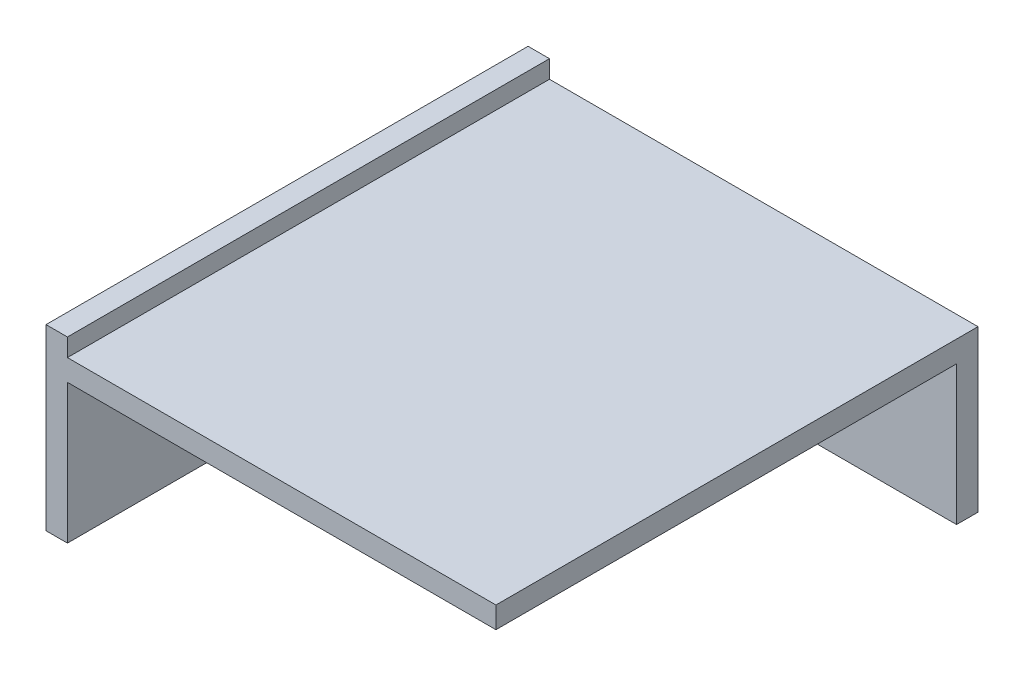
ISO-10303-21;
HEADER;
FILE_DESCRIPTION(('STEP AP214'),'2;1');
FILE_NAME('part.step','',(''),(''),'','','');
FILE_SCHEMA(('AUTOMOTIVE_DESIGN { 1 0 10303 214 1 1 1 1 }'));
ENDSEC;
DATA;
#1=APPLICATION_CONTEXT('core data for automotive mechanical design processes');
#2=APPLICATION_PROTOCOL_DEFINITION('international standard','automotive_design',2000,#1);
#3=PRODUCT_CONTEXT('',#1,'mechanical');
#4=PRODUCT('Part','Part','',(#3));
#5=PRODUCT_RELATED_PRODUCT_CATEGORY('part','',(#4));
#6=PRODUCT_DEFINITION_FORMATION('','',#4);
#7=PRODUCT_DEFINITION_CONTEXT('part definition',#1,'design');
#8=PRODUCT_DEFINITION('design','',#6,#7);
#9=PRODUCT_DEFINITION_SHAPE('','',#8);
#10=(LENGTH_UNIT() NAMED_UNIT(*) SI_UNIT(.MILLI.,.METRE.));
#11=(NAMED_UNIT(*) PLANE_ANGLE_UNIT() SI_UNIT($,.RADIAN.));
#12=(NAMED_UNIT(*) SI_UNIT($,.STERADIAN.) SOLID_ANGLE_UNIT());
#13=UNCERTAINTY_MEASURE_WITH_UNIT(LENGTH_MEASURE(1.E-05),#10,'distance_accuracy_value','');
#14=(GEOMETRIC_REPRESENTATION_CONTEXT(3) GLOBAL_UNCERTAINTY_ASSIGNED_CONTEXT((#13)) GLOBAL_UNIT_ASSIGNED_CONTEXT((#10,
#11,#12)) REPRESENTATION_CONTEXT('',''));
#15=CARTESIAN_POINT('',(0.,0.,0.));
#16=DIRECTION('',(0.,0.,1.));
#17=DIRECTION('',(1.,0.,0.));
#18=AXIS2_PLACEMENT_3D('',#15,#16,#17);
#19=CARTESIAN_POINT('',(0.,0.,0.));
#20=DIRECTION('',(0.,-1.,0.));
#21=DIRECTION('',(0.,0.,-1.));
#22=AXIS2_PLACEMENT_3D('',#19,#20,#21);
#23=PLANE('',#22);
#24=DIRECTION('',(0.,0.,1.));
#25=VECTOR('',#24,1.);
#26=CARTESIAN_POINT('',(0.,0.,0.));
#27=LINE('',#26,#25);
#28=CARTESIAN_POINT('',(0.,0.,-258.));
#29=VERTEX_POINT('',#28);
#30=CARTESIAN_POINT('',(0.,0.,0.));
#31=VERTEX_POINT('',#30);
#32=EDGE_CURVE('E36',#29,#31,#27,.T.);
#33=ORIENTED_EDGE('',*,*,#32,.F.);
#34=DIRECTION('',(-1.,0.,0.));
#35=VECTOR('',#34,1.);
#36=CARTESIAN_POINT('',(240.,0.,-258.));
#37=LINE('',#36,#35);
#38=CARTESIAN_POINT('',(240.,0.,-258.));
#39=VERTEX_POINT('',#38);
#40=EDGE_CURVE('E118',#39,#29,#37,.T.);
#41=ORIENTED_EDGE('',*,*,#40,.F.);
#42=DIRECTION('',(0.,0.,-1.));
#43=VECTOR('',#42,1.);
#44=CARTESIAN_POINT('',(240.,0.,0.));
#45=LINE('',#44,#43);
#46=CARTESIAN_POINT('',(240.,0.,0.));
#47=VERTEX_POINT('',#46);
#48=EDGE_CURVE('E127',#47,#39,#45,.T.);
#49=ORIENTED_EDGE('',*,*,#48,.F.);
#50=DIRECTION('',(1.,0.,0.));
#51=VECTOR('',#50,1.);
#52=CARTESIAN_POINT('',(0.,0.,0.));
#53=LINE('',#52,#51);
#54=EDGE_CURVE('E71',#31,#47,#53,.T.);
#55=ORIENTED_EDGE('',*,*,#54,.F.);
#56=EDGE_LOOP('',(#33,#41,#49,#55));
#57=FACE_BOUND('',#56,.T.);
#58=ADVANCED_FACE('F32',(#57),#23,.T.);
#59=CARTESIAN_POINT('',(0.,0.,0.));
#60=DIRECTION('',(-1.,0.,0.));
#61=DIRECTION('',(0.,0.,1.));
#62=AXIS2_PLACEMENT_3D('',#59,#60,#61);
#63=PLANE('',#62);
#64=DIRECTION('',(0.,-1.,0.));
#65=VECTOR('',#64,1.);
#66=CARTESIAN_POINT('',(0.,-78.,-258.));
#67=LINE('',#66,#65);
#68=CARTESIAN_POINT('',(0.,-78.,-258.));
#69=VERTEX_POINT('',#68);
#70=EDGE_CURVE('E123',#29,#69,#67,.T.);
#71=ORIENTED_EDGE('',*,*,#70,.F.);
#72=ORIENTED_EDGE('',*,*,#32,.T.);
#73=DIRECTION('',(0.,1.,0.));
#74=VECTOR('',#73,1.);
#75=CARTESIAN_POINT('',(0.,22.,0.));
#76=LINE('',#75,#74);
#77=CARTESIAN_POINT('',(0.,-78.,0.));
#78=VERTEX_POINT('',#77);
#79=EDGE_CURVE('E173',#78,#31,#76,.T.);
#80=ORIENTED_EDGE('',*,*,#79,.F.);
#81=DIRECTION('',(0.,0.,1.));
#82=VECTOR('',#81,1.);
#83=CARTESIAN_POINT('',(0.,-78.,-270.));
#84=LINE('',#83,#82);
#85=EDGE_CURVE('E166',#69,#78,#84,.T.);
#86=ORIENTED_EDGE('',*,*,#85,.F.);
#87=EDGE_LOOP('',(#71,#72,#80,#86));
#88=FACE_BOUND('',#87,.T.);
#89=ADVANCED_FACE('F209',(#88),#63,.F.);
#90=CARTESIAN_POINT('',(0.,12.,0.));
#91=DIRECTION('',(0.,0.,-1.));
#92=DIRECTION('',(-1.,0.,0.));
#93=AXIS2_PLACEMENT_3D('',#90,#91,#92);
#94=PLANE('',#93);
#95=ORIENTED_EDGE('',*,*,#54,.T.);
#96=DIRECTION('',(0.,-1.,0.));
#97=VECTOR('',#96,1.);
#98=CARTESIAN_POINT('',(240.,12.,0.));
#99=LINE('',#98,#97);
#100=CARTESIAN_POINT('',(240.,12.,0.));
#101=VERTEX_POINT('',#100);
#102=EDGE_CURVE('E11',#101,#47,#99,.T.);
#103=ORIENTED_EDGE('',*,*,#102,.F.);
#104=DIRECTION('',(1.,0.,0.));
#105=VECTOR('',#104,1.);
#106=CARTESIAN_POINT('',(0.,12.,0.));
#107=LINE('',#106,#105);
#108=CARTESIAN_POINT('',(0.,12.,0.));
#109=VERTEX_POINT('',#108);
#110=EDGE_CURVE('E134',#109,#101,#107,.T.);
#111=ORIENTED_EDGE('',*,*,#110,.F.);
#112=CARTESIAN_POINT('',(0.,22.,0.));
#113=VERTEX_POINT('',#112);
#114=EDGE_CURVE('E149',#109,#113,#76,.T.);
#115=ORIENTED_EDGE('',*,*,#114,.T.);
#116=DIRECTION('',(1.,0.,0.));
#117=VECTOR('',#116,1.);
#118=CARTESIAN_POINT('',(-12.,22.,0.));
#119=LINE('',#118,#117);
#120=CARTESIAN_POINT('',(-12.,22.,0.));
#121=VERTEX_POINT('',#120);
#122=EDGE_CURVE('E185',#121,#113,#119,.T.);
#123=ORIENTED_EDGE('',*,*,#122,.F.);
#124=DIRECTION('',(0.,1.,0.));
#125=VECTOR('',#124,1.);
#126=CARTESIAN_POINT('',(-12.,22.,0.));
#127=LINE('',#126,#125);
#128=CARTESIAN_POINT('',(-12.,-78.,0.));
#129=VERTEX_POINT('',#128);
#130=EDGE_CURVE('E199',#129,#121,#127,.T.);
#131=ORIENTED_EDGE('',*,*,#130,.F.);
#132=DIRECTION('',(1.,0.,0.));
#133=VECTOR('',#132,1.);
#134=CARTESIAN_POINT('',(-12.,-78.,0.));
#135=LINE('',#134,#133);
#136=EDGE_CURVE('E187',#129,#78,#135,.T.);
#137=ORIENTED_EDGE('',*,*,#136,.T.);
#138=ORIENTED_EDGE('',*,*,#79,.T.);
#139=EDGE_LOOP('',(#95,#103,#111,#115,#123,#131,#137,#138));
#140=FACE_BOUND('',#139,.T.);
#141=ADVANCED_FACE('F34',(#140),#94,.F.);
#142=CARTESIAN_POINT('',(240.,12.,0.));
#143=DIRECTION('',(-1.,0.,0.));
#144=DIRECTION('',(0.,0.,1.));
#145=AXIS2_PLACEMENT_3D('',#142,#143,#144);
#146=PLANE('',#145);
#147=ORIENTED_EDGE('',*,*,#48,.T.);
#148=DIRECTION('',(0.,-1.,0.));
#149=VECTOR('',#148,1.);
#150=CARTESIAN_POINT('',(240.,-78.,-258.));
#151=LINE('',#150,#149);
#152=CARTESIAN_POINT('',(240.,-78.,-258.));
#153=VERTEX_POINT('',#152);
#154=EDGE_CURVE('E115',#39,#153,#151,.T.);
#155=ORIENTED_EDGE('',*,*,#154,.T.);
#156=DIRECTION('',(0.,0.,-1.));
#157=VECTOR('',#156,1.);
#158=CARTESIAN_POINT('',(240.,-78.,-270.));
#159=LINE('',#158,#157);
#160=CARTESIAN_POINT('',(240.,-78.,-270.));
#161=VERTEX_POINT('',#160);
#162=EDGE_CURVE('E122',#153,#161,#159,.T.);
#163=ORIENTED_EDGE('',*,*,#162,.T.);
#164=DIRECTION('',(0.,-1.,0.));
#165=VECTOR('',#164,1.);
#166=CARTESIAN_POINT('',(240.,12.,-270.));
#167=LINE('',#166,#165);
#168=CARTESIAN_POINT('',(240.,12.,-270.));
#169=VERTEX_POINT('',#168);
#170=EDGE_CURVE('E42',#169,#161,#167,.T.);
#171=ORIENTED_EDGE('',*,*,#170,.F.);
#172=DIRECTION('',(0.,0.,-1.));
#173=VECTOR('',#172,1.);
#174=CARTESIAN_POINT('',(240.,12.,0.));
#175=LINE('',#174,#173);
#176=EDGE_CURVE('E59',#101,#169,#175,.T.);
#177=ORIENTED_EDGE('',*,*,#176,.F.);
#178=ORIENTED_EDGE('',*,*,#102,.T.);
#179=EDGE_LOOP('',(#147,#155,#163,#171,#177,#178));
#180=FACE_BOUND('',#179,.T.);
#181=ADVANCED_FACE('F130',(#180),#146,.F.);
#182=CARTESIAN_POINT('',(0.,12.,-270.));
#183=DIRECTION('',(0.,0.,1.));
#184=DIRECTION('',(1.,0.,0.));
#185=AXIS2_PLACEMENT_3D('',#182,#183,#184);
#186=PLANE('',#185);
#187=ORIENTED_EDGE('',*,*,#170,.T.);
#188=DIRECTION('',(1.,0.,0.));
#189=VECTOR('',#188,1.);
#190=CARTESIAN_POINT('',(-12.,-78.,-270.));
#191=LINE('',#190,#189);
#192=CARTESIAN_POINT('',(-12.,-78.,-270.));
#193=VERTEX_POINT('',#192);
#194=EDGE_CURVE('E171',#193,#161,#191,.T.);
#195=ORIENTED_EDGE('',*,*,#194,.F.);
#196=DIRECTION('',(0.,-1.,0.));
#197=VECTOR('',#196,1.);
#198=CARTESIAN_POINT('',(-12.,22.,-270.));
#199=LINE('',#198,#197);
#200=CARTESIAN_POINT('',(-12.,22.,-270.));
#201=VERTEX_POINT('',#200);
#202=EDGE_CURVE('E183',#201,#193,#199,.T.);
#203=ORIENTED_EDGE('',*,*,#202,.F.);
#204=DIRECTION('',(1.,0.,0.));
#205=VECTOR('',#204,1.);
#206=CARTESIAN_POINT('',(-12.,22.,-270.));
#207=LINE('',#206,#205);
#208=CARTESIAN_POINT('',(0.,22.,-270.));
#209=VERTEX_POINT('',#208);
#210=EDGE_CURVE('E163',#201,#209,#207,.T.);
#211=ORIENTED_EDGE('',*,*,#210,.T.);
#212=DIRECTION('',(0.,-1.,0.));
#213=VECTOR('',#212,1.);
#214=CARTESIAN_POINT('',(0.,22.,-270.));
#215=LINE('',#214,#213);
#216=CARTESIAN_POINT('',(0.,12.,-270.));
#217=VERTEX_POINT('',#216);
#218=EDGE_CURVE('E128',#209,#217,#215,.T.);
#219=ORIENTED_EDGE('',*,*,#218,.T.);
#220=DIRECTION('',(-1.,0.,0.));
#221=VECTOR('',#220,1.);
#222=CARTESIAN_POINT('',(0.,12.,-270.));
#223=LINE('',#222,#221);
#224=EDGE_CURVE('E140',#169,#217,#223,.T.);
#225=ORIENTED_EDGE('',*,*,#224,.F.);
#226=EDGE_LOOP('',(#187,#195,#203,#211,#219,#225));
#227=FACE_BOUND('',#226,.T.);
#228=ADVANCED_FACE('F156',(#227),#186,.F.);
#229=CARTESIAN_POINT('',(0.,12.,0.));
#230=DIRECTION('',(0.,-1.,0.));
#231=DIRECTION('',(0.,0.,-1.));
#232=AXIS2_PLACEMENT_3D('',#229,#230,#231);
#233=PLANE('',#232);
#234=DIRECTION('',(0.,0.,1.));
#235=VECTOR('',#234,1.);
#236=CARTESIAN_POINT('',(0.,12.,0.));
#237=LINE('',#236,#235);
#238=EDGE_CURVE('E131',#217,#109,#237,.T.);
#239=ORIENTED_EDGE('',*,*,#238,.T.);
#240=ORIENTED_EDGE('',*,*,#110,.T.);
#241=ORIENTED_EDGE('',*,*,#176,.T.);
#242=ORIENTED_EDGE('',*,*,#224,.T.);
#243=EDGE_LOOP('',(#239,#240,#241,#242));
#244=FACE_BOUND('',#243,.T.);
#245=ADVANCED_FACE('F153',(#244),#233,.F.);
#246=CARTESIAN_POINT('',(-12.,-78.,-270.));
#247=DIRECTION('',(0.,1.,0.));
#248=DIRECTION('',(0.,0.,1.));
#249=AXIS2_PLACEMENT_3D('',#246,#247,#248);
#250=PLANE('',#249);
#251=ORIENTED_EDGE('',*,*,#194,.T.);
#252=ORIENTED_EDGE('',*,*,#162,.F.);
#253=DIRECTION('',(-1.,0.,0.));
#254=VECTOR('',#253,1.);
#255=CARTESIAN_POINT('',(240.,-78.,-258.));
#256=LINE('',#255,#254);
#257=EDGE_CURVE('E50',#153,#69,#256,.T.);
#258=ORIENTED_EDGE('',*,*,#257,.T.);
#259=ORIENTED_EDGE('',*,*,#85,.T.);
#260=ORIENTED_EDGE('',*,*,#136,.F.);
#261=DIRECTION('',(0.,0.,1.));
#262=VECTOR('',#261,1.);
#263=CARTESIAN_POINT('',(-12.,-78.,-270.));
#264=LINE('',#263,#262);
#265=EDGE_CURVE('E192',#193,#129,#264,.T.);
#266=ORIENTED_EDGE('',*,*,#265,.F.);
#267=EDGE_LOOP('',(#251,#252,#258,#259,#260,#266));
#268=FACE_BOUND('',#267,.T.);
#269=ADVANCED_FACE('F191',(#268),#250,.F.);
#270=CARTESIAN_POINT('',(-12.,22.,-270.));
#271=DIRECTION('',(0.,-1.,0.));
#272=DIRECTION('',(0.,0.,-1.));
#273=AXIS2_PLACEMENT_3D('',#270,#271,#272);
#274=PLANE('',#273);
#275=DIRECTION('',(0.,0.,-1.));
#276=VECTOR('',#275,1.);
#277=CARTESIAN_POINT('',(0.,22.,-270.));
#278=LINE('',#277,#276);
#279=EDGE_CURVE('E180',#113,#209,#278,.T.);
#280=ORIENTED_EDGE('',*,*,#279,.T.);
#281=ORIENTED_EDGE('',*,*,#210,.F.);
#282=DIRECTION('',(0.,0.,-1.));
#283=VECTOR('',#282,1.);
#284=CARTESIAN_POINT('',(-12.,22.,-270.));
#285=LINE('',#284,#283);
#286=EDGE_CURVE('E176',#121,#201,#285,.T.);
#287=ORIENTED_EDGE('',*,*,#286,.F.);
#288=ORIENTED_EDGE('',*,*,#122,.T.);
#289=EDGE_LOOP('',(#280,#281,#287,#288));
#290=FACE_BOUND('',#289,.T.);
#291=ADVANCED_FACE('F205',(#290),#274,.F.);
#292=CARTESIAN_POINT('',(-12.,0.,0.));
#293=DIRECTION('',(-1.,0.,0.));
#294=DIRECTION('',(0.,0.,1.));
#295=AXIS2_PLACEMENT_3D('',#292,#293,#294);
#296=PLANE('',#295);
#297=ORIENTED_EDGE('',*,*,#202,.T.);
#298=ORIENTED_EDGE('',*,*,#265,.T.);
#299=ORIENTED_EDGE('',*,*,#130,.T.);
#300=ORIENTED_EDGE('',*,*,#286,.T.);
#301=EDGE_LOOP('',(#297,#298,#299,#300));
#302=FACE_BOUND('',#301,.T.);
#303=ADVANCED_FACE('F203',(#302),#296,.T.);
#304=ORIENTED_EDGE('',*,*,#238,.F.);
#305=ORIENTED_EDGE('',*,*,#218,.F.);
#306=ORIENTED_EDGE('',*,*,#279,.F.);
#307=ORIENTED_EDGE('',*,*,#114,.F.);
#308=EDGE_LOOP('',(#304,#305,#306,#307));
#309=FACE_BOUND('',#308,.T.);
#310=ADVANCED_FACE('F206',(#309),#63,.F.);
#311=CARTESIAN_POINT('',(240.,-78.,-258.));
#312=DIRECTION('',(0.,0.,-1.));
#313=DIRECTION('',(-1.,0.,0.));
#314=AXIS2_PLACEMENT_3D('',#311,#312,#313);
#315=PLANE('',#314);
#316=ORIENTED_EDGE('',*,*,#70,.T.);
#317=ORIENTED_EDGE('',*,*,#257,.F.);
#318=ORIENTED_EDGE('',*,*,#154,.F.);
#319=ORIENTED_EDGE('',*,*,#40,.T.);
#320=EDGE_LOOP('',(#316,#317,#318,#319));
#321=FACE_BOUND('',#320,.T.);
#322=ADVANCED_FACE('F117',(#321),#315,.F.);
#323=CLOSED_SHELL('',(#58,#89,#141,#181,#228,#245,#269,#291,#303,#310,#322));
#324=MANIFOLD_SOLID_BREP('B2',#323);
#325=ADVANCED_BREP_SHAPE_REPRESENTATION('',(#18,#324),#14);
#326=SHAPE_DEFINITION_REPRESENTATION(#9,#325);
ENDSEC;
END-ISO-10303-21;
